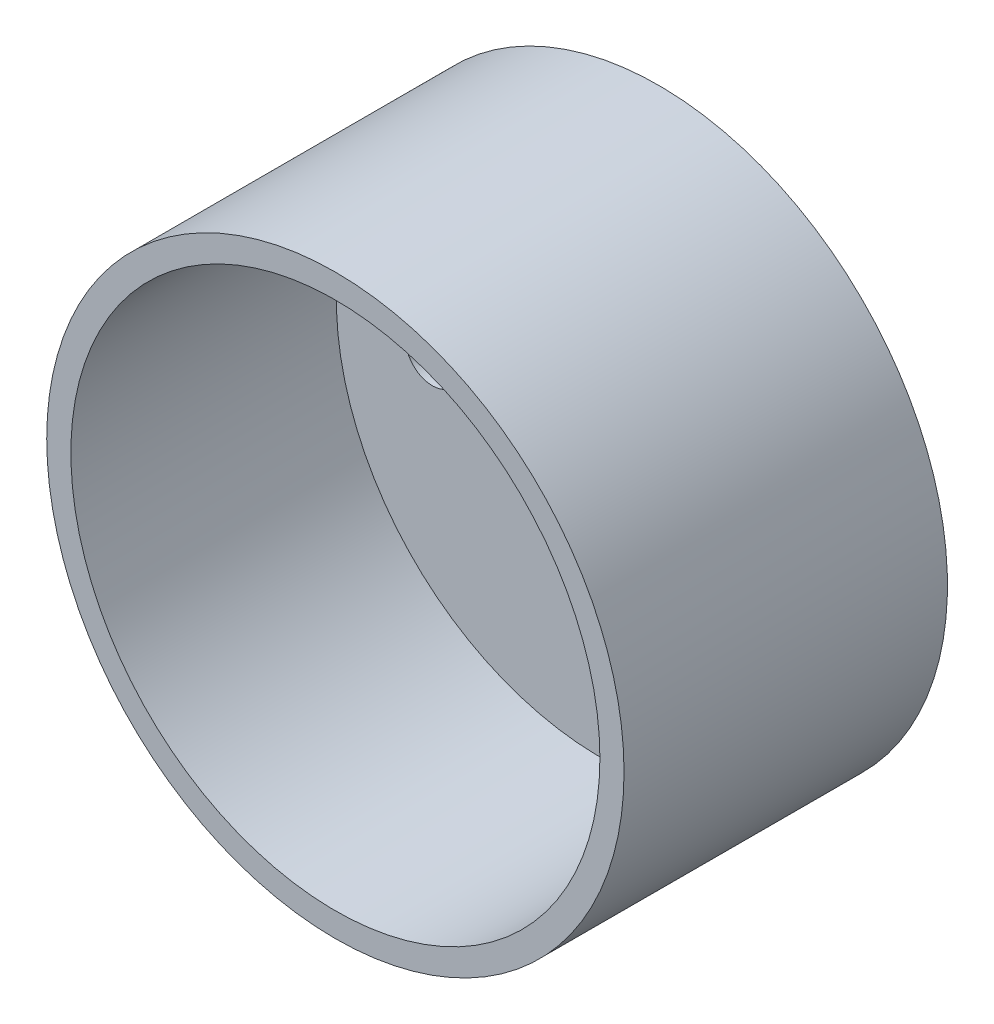
ISO-10303-21;
HEADER;
FILE_DESCRIPTION(('STEP AP214'),'2;1');
FILE_NAME('part.step','',(''),(''),'','','');
FILE_SCHEMA(('AUTOMOTIVE_DESIGN { 1 0 10303 214 1 1 1 1 }'));
ENDSEC;
DATA;
#1=APPLICATION_CONTEXT('core data for automotive mechanical design processes');
#2=APPLICATION_PROTOCOL_DEFINITION('international standard','automotive_design',2000,#1);
#3=PRODUCT_CONTEXT('',#1,'mechanical');
#4=PRODUCT('Part','Part','',(#3));
#5=PRODUCT_RELATED_PRODUCT_CATEGORY('part','',(#4));
#6=PRODUCT_DEFINITION_FORMATION('','',#4);
#7=PRODUCT_DEFINITION_CONTEXT('part definition',#1,'design');
#8=PRODUCT_DEFINITION('design','',#6,#7);
#9=PRODUCT_DEFINITION_SHAPE('','',#8);
#10=(LENGTH_UNIT() NAMED_UNIT(*) SI_UNIT(.MILLI.,.METRE.));
#11=(NAMED_UNIT(*) PLANE_ANGLE_UNIT() SI_UNIT($,.RADIAN.));
#12=(NAMED_UNIT(*) SI_UNIT($,.STERADIAN.) SOLID_ANGLE_UNIT());
#13=UNCERTAINTY_MEASURE_WITH_UNIT(LENGTH_MEASURE(1.E-05),#10,'distance_accuracy_value','');
#14=(GEOMETRIC_REPRESENTATION_CONTEXT(3) GLOBAL_UNCERTAINTY_ASSIGNED_CONTEXT((#13)) GLOBAL_UNIT_ASSIGNED_CONTEXT((#10,
#11,#12)) REPRESENTATION_CONTEXT('',''));
#15=CARTESIAN_POINT('',(0.,0.,0.));
#16=DIRECTION('',(0.,0.,1.));
#17=DIRECTION('',(1.,0.,0.));
#18=AXIS2_PLACEMENT_3D('',#15,#16,#17);
#19=CARTESIAN_POINT('',(0.,0.,55.));
#20=DIRECTION('',(0.,0.,1.));
#21=DIRECTION('',(1.,0.,0.));
#22=AXIS2_PLACEMENT_3D('',#19,#20,#21);
#23=PLANE('',#22);
#24=CARTESIAN_POINT('',(0.,0.,55.));
#25=DIRECTION('',(0.,0.,1.));
#26=DIRECTION('',(1.,0.,0.));
#27=AXIS2_PLACEMENT_3D('',#24,#25,#26);
#28=CIRCLE('',#27,59.8);
#29=CARTESIAN_POINT('',(59.8,0.,55.));
#30=VERTEX_POINT('',#29);
#31=EDGE_CURVE('E10',#30,#30,#28,.T.);
#32=ORIENTED_EDGE('',*,*,#31,.T.);
#33=EDGE_LOOP('',(#32));
#34=FACE_BOUND('',#33,.T.);
#35=CARTESIAN_POINT('',(0.,0.,55.));
#36=DIRECTION('',(0.,0.,1.));
#37=DIRECTION('',(1.,0.,0.));
#38=AXIS2_PLACEMENT_3D('',#35,#36,#37);
#39=CIRCLE('',#38,54.8);
#40=CARTESIAN_POINT('',(54.8,0.,55.));
#41=VERTEX_POINT('',#40);
#42=EDGE_CURVE('E45',#41,#41,#39,.T.);
#43=ORIENTED_EDGE('',*,*,#42,.F.);
#44=EDGE_LOOP('',(#43));
#45=FACE_BOUND('',#44,.T.);
#46=ADVANCED_FACE('F37',(#34,#45),#23,.T.);
#47=CARTESIAN_POINT('',(0.,0.,55.));
#48=DIRECTION('',(0.,0.,-1.));
#49=DIRECTION('',(-1.,0.,0.));
#50=AXIS2_PLACEMENT_3D('',#47,#48,#49);
#51=CYLINDRICAL_SURFACE('',#50,59.8);
#52=ORIENTED_EDGE('',*,*,#31,.F.);
#53=EDGE_LOOP('',(#52));
#54=FACE_BOUND('',#53,.T.);
#55=CARTESIAN_POINT('',(0.,0.,-12.));
#56=DIRECTION('',(0.,0.,-1.));
#57=DIRECTION('',(-1.,0.,0.));
#58=AXIS2_PLACEMENT_3D('',#55,#56,#57);
#59=CIRCLE('',#58,59.8);
#60=CARTESIAN_POINT('',(-59.8,0.,-12.));
#61=VERTEX_POINT('',#60);
#62=EDGE_CURVE('E56',#61,#61,#59,.T.);
#63=ORIENTED_EDGE('',*,*,#62,.F.);
#64=EDGE_LOOP('',(#63));
#65=FACE_BOUND('',#64,.T.);
#66=ADVANCED_FACE('F39',(#54,#65),#51,.T.);
#67=CARTESIAN_POINT('',(0.,0.,55.));
#68=DIRECTION('',(0.,0.,-1.));
#69=DIRECTION('',(-1.,0.,0.));
#70=AXIS2_PLACEMENT_3D('',#67,#68,#69);
#71=CYLINDRICAL_SURFACE('',#70,54.8);
#72=ORIENTED_EDGE('',*,*,#42,.T.);
#73=EDGE_LOOP('',(#72));
#74=FACE_BOUND('',#73,.T.);
#75=CARTESIAN_POINT('',(0.,0.,0.));
#76=DIRECTION('',(0.,0.,1.));
#77=DIRECTION('',(1.,0.,0.));
#78=AXIS2_PLACEMENT_3D('',#75,#76,#77);
#79=CIRCLE('',#78,54.8);
#80=CARTESIAN_POINT('',(54.8,0.,0.));
#81=VERTEX_POINT('',#80);
#82=EDGE_CURVE('E50',#81,#81,#79,.T.);
#83=ORIENTED_EDGE('',*,*,#82,.F.);
#84=EDGE_LOOP('',(#83));
#85=FACE_BOUND('',#84,.T.);
#86=ADVANCED_FACE('F93',(#74,#85),#71,.F.);
#87=CARTESIAN_POINT('',(0.,0.,0.));
#88=DIRECTION('',(0.,0.,-1.));
#89=DIRECTION('',(-1.,0.,0.));
#90=AXIS2_PLACEMENT_3D('',#87,#88,#89);
#91=PLANE('',#90);
#92=CARTESIAN_POINT('',(-34.9,0.,0.));
#93=DIRECTION('',(0.,0.,-1.));
#94=DIRECTION('',(-1.,0.,0.));
#95=AXIS2_PLACEMENT_3D('',#92,#93,#94);
#96=CIRCLE('',#95,5.55625);
#97=CARTESIAN_POINT('',(-40.45625,0.,0.));
#98=VERTEX_POINT('',#97);
#99=EDGE_CURVE('E70',#98,#98,#96,.T.);
#100=ORIENTED_EDGE('',*,*,#99,.T.);
#101=EDGE_LOOP('',(#100));
#102=FACE_BOUND('',#101,.T.);
#103=CARTESIAN_POINT('',(0.,0.,0.));
#104=DIRECTION('',(0.,0.,-1.));
#105=DIRECTION('',(-1.,0.,0.));
#106=AXIS2_PLACEMENT_3D('',#103,#104,#105);
#107=CIRCLE('',#106,15.);
#108=CARTESIAN_POINT('',(-15.,0.,0.));
#109=VERTEX_POINT('',#108);
#110=EDGE_CURVE('E62',#109,#109,#107,.T.);
#111=ORIENTED_EDGE('',*,*,#110,.T.);
#112=EDGE_LOOP('',(#111));
#113=FACE_BOUND('',#112,.T.);
#114=ORIENTED_EDGE('',*,*,#82,.T.);
#115=EDGE_LOOP('',(#114));
#116=FACE_BOUND('',#115,.T.);
#117=ADVANCED_FACE('F84',(#102,#113,#116),#91,.F.);
#118=CARTESIAN_POINT('',(0.,0.,-12.));
#119=DIRECTION('',(0.,0.,-1.));
#120=DIRECTION('',(-1.,0.,0.));
#121=AXIS2_PLACEMENT_3D('',#118,#119,#120);
#122=PLANE('',#121);
#123=CARTESIAN_POINT('',(0.,0.,-12.));
#124=DIRECTION('',(0.,0.,-1.));
#125=DIRECTION('',(-1.,0.,0.));
#126=AXIS2_PLACEMENT_3D('',#123,#124,#125);
#127=CIRCLE('',#126,15.);
#128=CARTESIAN_POINT('',(-15.,0.,-12.));
#129=VERTEX_POINT('',#128);
#130=EDGE_CURVE('E61',#129,#129,#127,.T.);
#131=ORIENTED_EDGE('',*,*,#130,.F.);
#132=EDGE_LOOP('',(#131));
#133=FACE_BOUND('',#132,.T.);
#134=ORIENTED_EDGE('',*,*,#62,.T.);
#135=EDGE_LOOP('',(#134));
#136=FACE_BOUND('',#135,.T.);
#137=CARTESIAN_POINT('',(-34.9,0.,-12.));
#138=DIRECTION('',(0.,0.,-1.));
#139=DIRECTION('',(-1.,0.,0.));
#140=AXIS2_PLACEMENT_3D('',#137,#138,#139);
#141=CIRCLE('',#140,5.55625);
#142=CARTESIAN_POINT('',(-40.45625,0.,-12.));
#143=VERTEX_POINT('',#142);
#144=EDGE_CURVE('E66',#143,#143,#141,.T.);
#145=ORIENTED_EDGE('',*,*,#144,.F.);
#146=EDGE_LOOP('',(#145));
#147=FACE_BOUND('',#146,.T.);
#148=ADVANCED_FACE('F81',(#133,#136,#147),#122,.T.);
#149=CARTESIAN_POINT('',(0.,0.,-12.));
#150=DIRECTION('',(0.,0.,1.));
#151=DIRECTION('',(1.,0.,0.));
#152=AXIS2_PLACEMENT_3D('',#149,#150,#151);
#153=CYLINDRICAL_SURFACE('',#152,15.);
#154=ORIENTED_EDGE('',*,*,#130,.T.);
#155=EDGE_LOOP('',(#154));
#156=FACE_BOUND('',#155,.T.);
#157=ORIENTED_EDGE('',*,*,#110,.F.);
#158=EDGE_LOOP('',(#157));
#159=FACE_BOUND('',#158,.T.);
#160=ADVANCED_FACE('F83',(#156,#159),#153,.F.);
#161=CARTESIAN_POINT('',(-34.9,0.,-12.));
#162=DIRECTION('',(0.,0.,1.));
#163=DIRECTION('',(1.,0.,0.));
#164=AXIS2_PLACEMENT_3D('',#161,#162,#163);
#165=CYLINDRICAL_SURFACE('',#164,5.55625);
#166=ORIENTED_EDGE('',*,*,#144,.T.);
#167=EDGE_LOOP('',(#166));
#168=FACE_BOUND('',#167,.T.);
#169=ORIENTED_EDGE('',*,*,#99,.F.);
#170=EDGE_LOOP('',(#169));
#171=FACE_BOUND('',#170,.T.);
#172=ADVANCED_FACE('F78',(#168,#171),#165,.F.);
#173=CLOSED_SHELL('',(#46,#66,#86,#117,#148,#160,#172));
#174=MANIFOLD_SOLID_BREP('B2',#173);
#175=ADVANCED_BREP_SHAPE_REPRESENTATION('',(#18,#174),#14);
#176=SHAPE_DEFINITION_REPRESENTATION(#9,#175);
ENDSEC;
END-ISO-10303-21;
